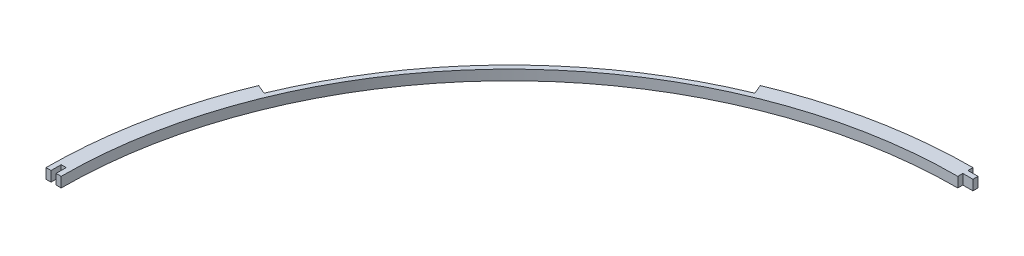
ISO-10303-21;
HEADER;
FILE_DESCRIPTION(('STEP AP214'),'2;1');
FILE_NAME('part.step','',(''),(''),'','','');
FILE_SCHEMA(('AUTOMOTIVE_DESIGN { 1 0 10303 214 1 1 1 1 }'));
ENDSEC;
DATA;
#1=APPLICATION_CONTEXT('core data for automotive mechanical design processes');
#2=APPLICATION_PROTOCOL_DEFINITION('international standard','automotive_design',2000,#1);
#3=PRODUCT_CONTEXT('',#1,'mechanical');
#4=PRODUCT('Part','Part','',(#3));
#5=PRODUCT_RELATED_PRODUCT_CATEGORY('part','',(#4));
#6=PRODUCT_DEFINITION_FORMATION('','',#4);
#7=PRODUCT_DEFINITION_CONTEXT('part definition',#1,'design');
#8=PRODUCT_DEFINITION('design','',#6,#7);
#9=PRODUCT_DEFINITION_SHAPE('','',#8);
#10=(LENGTH_UNIT() NAMED_UNIT(*) SI_UNIT(.MILLI.,.METRE.));
#11=(NAMED_UNIT(*) PLANE_ANGLE_UNIT() SI_UNIT($,.RADIAN.));
#12=(NAMED_UNIT(*) SI_UNIT($,.STERADIAN.) SOLID_ANGLE_UNIT());
#13=UNCERTAINTY_MEASURE_WITH_UNIT(LENGTH_MEASURE(1.E-05),#10,'distance_accuracy_value','');
#14=(GEOMETRIC_REPRESENTATION_CONTEXT(3) GLOBAL_UNCERTAINTY_ASSIGNED_CONTEXT((#13)) GLOBAL_UNIT_ASSIGNED_CONTEXT((#10,
#11,#12)) REPRESENTATION_CONTEXT('',''));
#15=CARTESIAN_POINT('',(0.,0.,0.));
#16=DIRECTION('',(0.,0.,1.));
#17=DIRECTION('',(1.,0.,0.));
#18=AXIS2_PLACEMENT_3D('',#15,#16,#17);
#19=CARTESIAN_POINT('',(-284.861,6.35,0.));
#20=DIRECTION('',(-1.,0.,0.));
#21=DIRECTION('',(0.,0.,1.));
#22=AXIS2_PLACEMENT_3D('',#19,#20,#21);
#23=PLANE('',#22);
#24=DIRECTION('',(0.,0.,-1.));
#25=VECTOR('',#24,1.);
#26=CARTESIAN_POINT('',(-284.861,0.,0.));
#27=LINE('',#26,#25);
#28=CARTESIAN_POINT('',(-284.861,0.,0.));
#29=VERTEX_POINT('',#28);
#30=CARTESIAN_POINT('',(-284.861,0.,-6.35));
#31=VERTEX_POINT('',#30);
#32=EDGE_CURVE('E175',#29,#31,#27,.T.);
#33=ORIENTED_EDGE('',*,*,#32,.F.);
#34=DIRECTION('',(0.,-1.,0.));
#35=VECTOR('',#34,1.);
#36=CARTESIAN_POINT('',(-284.861,6.35,0.));
#37=LINE('',#36,#35);
#38=CARTESIAN_POINT('',(-284.861,6.35,0.));
#39=VERTEX_POINT('',#38);
#40=EDGE_CURVE('E11',#39,#29,#37,.T.);
#41=ORIENTED_EDGE('',*,*,#40,.F.);
#42=DIRECTION('',(0.,0.,-1.));
#43=VECTOR('',#42,1.);
#44=CARTESIAN_POINT('',(-284.861,6.35,0.));
#45=LINE('',#44,#43);
#46=CARTESIAN_POINT('',(-284.861,6.35,-6.35));
#47=VERTEX_POINT('',#46);
#48=EDGE_CURVE('E217',#39,#47,#45,.T.);
#49=ORIENTED_EDGE('',*,*,#48,.T.);
#50=DIRECTION('',(0.,-1.,0.));
#51=VECTOR('',#50,1.);
#52=CARTESIAN_POINT('',(-284.861,6.35,-6.35));
#53=LINE('',#52,#51);
#54=EDGE_CURVE('E50',#47,#31,#53,.T.);
#55=ORIENTED_EDGE('',*,*,#54,.T.);
#56=EDGE_LOOP('',(#33,#41,#49,#55));
#57=FACE_BOUND('',#56,.T.);
#58=ADVANCED_FACE('F34',(#57),#23,.T.);
#59=CARTESIAN_POINT('',(0.,6.35,0.));
#60=DIRECTION('',(0.,0.,-1.));
#61=DIRECTION('',(-1.,0.,0.));
#62=AXIS2_PLACEMENT_3D('',#59,#60,#61);
#63=PLANE('',#62);
#64=DIRECTION('',(1.,0.,0.));
#65=VECTOR('',#64,1.);
#66=CARTESIAN_POINT('',(0.,0.,0.));
#67=LINE('',#66,#65);
#68=CARTESIAN_POINT('',(-281.686,0.,0.));
#69=VERTEX_POINT('',#68);
#70=EDGE_CURVE('E177',#29,#69,#67,.T.);
#71=ORIENTED_EDGE('',*,*,#70,.T.);
#72=DIRECTION('',(0.,-1.,0.));
#73=VECTOR('',#72,1.);
#74=CARTESIAN_POINT('',(-281.686,6.35,0.));
#75=LINE('',#74,#73);
#76=CARTESIAN_POINT('',(-281.686,6.35,0.));
#77=VERTEX_POINT('',#76);
#78=EDGE_CURVE('E42',#77,#69,#75,.T.);
#79=ORIENTED_EDGE('',*,*,#78,.F.);
#80=DIRECTION('',(1.,0.,0.));
#81=VECTOR('',#80,1.);
#82=CARTESIAN_POINT('',(0.,6.35,0.));
#83=LINE('',#82,#81);
#84=EDGE_CURVE('E264',#39,#77,#83,.T.);
#85=ORIENTED_EDGE('',*,*,#84,.F.);
#86=ORIENTED_EDGE('',*,*,#40,.T.);
#87=EDGE_LOOP('',(#71,#79,#85,#86));
#88=FACE_BOUND('',#87,.T.);
#89=ADVANCED_FACE('F251',(#88),#63,.F.);
#90=CARTESIAN_POINT('',(0.,6.35,0.));
#91=DIRECTION('',(0.,-1.,0.));
#92=DIRECTION('',(0.,0.,-1.));
#93=AXIS2_PLACEMENT_3D('',#90,#91,#92);
#94=CYLINDRICAL_SURFACE('',#93,281.686);
#95=CARTESIAN_POINT('',(0.,0.,0.));
#96=DIRECTION('',(0.,1.,0.));
#97=DIRECTION('',(0.,0.,1.));
#98=AXIS2_PLACEMENT_3D('',#95,#96,#97);
#99=CIRCLE('',#98,281.686);
#100=CARTESIAN_POINT('',(0.,0.,-281.686));
#101=VERTEX_POINT('',#100);
#102=EDGE_CURVE('E180',#101,#69,#99,.T.);
#103=ORIENTED_EDGE('',*,*,#102,.F.);
#104=DIRECTION('',(0.,-1.,0.));
#105=VECTOR('',#104,1.);
#106=CARTESIAN_POINT('',(0.,6.35,-281.686));
#107=LINE('',#106,#105);
#108=CARTESIAN_POINT('',(0.,6.35,-281.686));
#109=VERTEX_POINT('',#108);
#110=EDGE_CURVE('E241',#109,#101,#107,.T.);
#111=ORIENTED_EDGE('',*,*,#110,.F.);
#112=CARTESIAN_POINT('',(0.,6.35,0.));
#113=DIRECTION('',(0.,1.,0.));
#114=DIRECTION('',(0.,0.,1.));
#115=AXIS2_PLACEMENT_3D('',#112,#113,#114);
#116=CIRCLE('',#115,281.686);
#117=EDGE_CURVE('E248',#109,#77,#116,.T.);
#118=ORIENTED_EDGE('',*,*,#117,.T.);
#119=ORIENTED_EDGE('',*,*,#78,.T.);
#120=EDGE_LOOP('',(#103,#111,#118,#119));
#121=FACE_BOUND('',#120,.T.);
#122=ADVANCED_FACE('F246',(#121),#94,.F.);
#123=CARTESIAN_POINT('',(0.,6.35,0.));
#124=DIRECTION('',(1.,0.,0.));
#125=DIRECTION('',(0.,0.,-1.));
#126=AXIS2_PLACEMENT_3D('',#123,#124,#125);
#127=PLANE('',#126);
#128=DIRECTION('',(0.,0.,1.));
#129=VECTOR('',#128,1.);
#130=CARTESIAN_POINT('',(0.,0.,0.));
#131=LINE('',#130,#129);
#132=CARTESIAN_POINT('',(0.,0.,-284.861));
#133=VERTEX_POINT('',#132);
#134=EDGE_CURVE('E183',#133,#101,#131,.T.);
#135=ORIENTED_EDGE('',*,*,#134,.F.);
#136=DIRECTION('',(0.,-1.,0.));
#137=VECTOR('',#136,1.);
#138=CARTESIAN_POINT('',(0.,6.35,-284.861));
#139=LINE('',#138,#137);
#140=CARTESIAN_POINT('',(0.,6.35,-284.861));
#141=VERTEX_POINT('',#140);
#142=EDGE_CURVE('E239',#141,#133,#139,.T.);
#143=ORIENTED_EDGE('',*,*,#142,.F.);
#144=DIRECTION('',(0.,0.,1.));
#145=VECTOR('',#144,1.);
#146=CARTESIAN_POINT('',(0.,6.35,0.));
#147=LINE('',#146,#145);
#148=EDGE_CURVE('E261',#141,#109,#147,.T.);
#149=ORIENTED_EDGE('',*,*,#148,.T.);
#150=ORIENTED_EDGE('',*,*,#110,.T.);
#151=EDGE_LOOP('',(#135,#143,#149,#150));
#152=FACE_BOUND('',#151,.T.);
#153=ADVANCED_FACE('F258',(#152),#127,.T.);
#154=CARTESIAN_POINT('',(0.,6.35,-284.861));
#155=DIRECTION('',(0.,0.,1.));
#156=DIRECTION('',(1.,0.,0.));
#157=AXIS2_PLACEMENT_3D('',#154,#155,#156);
#158=PLANE('',#157);
#159=DIRECTION('',(-1.,0.,0.));
#160=VECTOR('',#159,1.);
#161=CARTESIAN_POINT('',(0.,0.,-284.861));
#162=LINE('',#161,#160);
#163=CARTESIAN_POINT('',(6.35,0.,-284.861));
#164=VERTEX_POINT('',#163);
#165=EDGE_CURVE('E186',#164,#133,#162,.T.);
#166=ORIENTED_EDGE('',*,*,#165,.F.);
#167=DIRECTION('',(0.,-1.,0.));
#168=VECTOR('',#167,1.);
#169=CARTESIAN_POINT('',(6.35,6.35,-284.861));
#170=LINE('',#169,#168);
#171=CARTESIAN_POINT('',(6.35,6.35,-284.861));
#172=VERTEX_POINT('',#171);
#173=EDGE_CURVE('E237',#172,#164,#170,.T.);
#174=ORIENTED_EDGE('',*,*,#173,.F.);
#175=DIRECTION('',(-1.,0.,0.));
#176=VECTOR('',#175,1.);
#177=CARTESIAN_POINT('',(0.,6.35,-284.861));
#178=LINE('',#177,#176);
#179=EDGE_CURVE('E266',#172,#141,#178,.T.);
#180=ORIENTED_EDGE('',*,*,#179,.T.);
#181=ORIENTED_EDGE('',*,*,#142,.T.);
#182=EDGE_LOOP('',(#166,#174,#180,#181));
#183=FACE_BOUND('',#182,.T.);
#184=ADVANCED_FACE('F320',(#183),#158,.T.);
#185=CARTESIAN_POINT('',(6.35,6.35,0.));
#186=DIRECTION('',(-1.,0.,0.));
#187=DIRECTION('',(0.,0.,1.));
#188=AXIS2_PLACEMENT_3D('',#185,#186,#187);
#189=PLANE('',#188);
#190=DIRECTION('',(0.,0.,-1.));
#191=VECTOR('',#190,1.);
#192=CARTESIAN_POINT('',(6.35,0.,0.));
#193=LINE('',#192,#191);
#194=CARTESIAN_POINT('',(6.35,0.,-288.036));
#195=VERTEX_POINT('',#194);
#196=EDGE_CURVE('E189',#164,#195,#193,.T.);
#197=ORIENTED_EDGE('',*,*,#196,.T.);
#198=DIRECTION('',(0.,-1.,0.));
#199=VECTOR('',#198,1.);
#200=CARTESIAN_POINT('',(6.35,6.35,-288.036));
#201=LINE('',#200,#199);
#202=CARTESIAN_POINT('',(6.35,6.35,-288.036));
#203=VERTEX_POINT('',#202);
#204=EDGE_CURVE('E235',#203,#195,#201,.T.);
#205=ORIENTED_EDGE('',*,*,#204,.F.);
#206=DIRECTION('',(0.,0.,-1.));
#207=VECTOR('',#206,1.);
#208=CARTESIAN_POINT('',(6.35,6.35,0.));
#209=LINE('',#208,#207);
#210=EDGE_CURVE('E272',#172,#203,#209,.T.);
#211=ORIENTED_EDGE('',*,*,#210,.F.);
#212=ORIENTED_EDGE('',*,*,#173,.T.);
#213=EDGE_LOOP('',(#197,#205,#211,#212));
#214=FACE_BOUND('',#213,.T.);
#215=ADVANCED_FACE('F323',(#214),#189,.F.);
#216=CARTESIAN_POINT('',(-2.51798581984985E-12,6.35,-288.036));
#217=DIRECTION('',(0.,0.,-1.));
#218=DIRECTION('',(-1.,0.,0.));
#219=AXIS2_PLACEMENT_3D('',#216,#217,#218);
#220=PLANE('',#219);
#221=DIRECTION('',(1.,0.,0.));
#222=VECTOR('',#221,1.);
#223=CARTESIAN_POINT('',(-2.51798581984985E-12,0.,-288.036));
#224=LINE('',#223,#222);
#225=CARTESIAN_POINT('',(0.,0.,-288.036));
#226=VERTEX_POINT('',#225);
#227=EDGE_CURVE('E192',#226,#195,#224,.T.);
#228=ORIENTED_EDGE('',*,*,#227,.F.);
#229=DIRECTION('',(0.,-1.,0.));
#230=VECTOR('',#229,1.);
#231=CARTESIAN_POINT('',(0.,6.35,-288.036));
#232=LINE('',#231,#230);
#233=CARTESIAN_POINT('',(0.,6.35,-288.036));
#234=VERTEX_POINT('',#233);
#235=EDGE_CURVE('E233',#234,#226,#232,.T.);
#236=ORIENTED_EDGE('',*,*,#235,.F.);
#237=DIRECTION('',(1.,0.,0.));
#238=VECTOR('',#237,1.);
#239=CARTESIAN_POINT('',(-2.51798581984985E-12,6.35,-288.036));
#240=LINE('',#239,#238);
#241=EDGE_CURVE('E274',#234,#203,#240,.T.);
#242=ORIENTED_EDGE('',*,*,#241,.T.);
#243=ORIENTED_EDGE('',*,*,#204,.T.);
#244=EDGE_LOOP('',(#228,#236,#242,#243));
#245=FACE_BOUND('',#244,.T.);
#246=ADVANCED_FACE('F327',(#245),#220,.T.);
#247=CARTESIAN_POINT('',(0.,6.35,0.));
#248=DIRECTION('',(1.,0.,0.));
#249=DIRECTION('',(0.,0.,-1.));
#250=AXIS2_PLACEMENT_3D('',#247,#248,#249);
#251=PLANE('',#250);
#252=DIRECTION('',(0.,0.,1.));
#253=VECTOR('',#252,1.);
#254=CARTESIAN_POINT('',(0.,0.,0.));
#255=LINE('',#254,#253);
#256=CARTESIAN_POINT('',(0.,0.,-291.211));
#257=VERTEX_POINT('',#256);
#258=EDGE_CURVE('E195',#257,#226,#255,.T.);
#259=ORIENTED_EDGE('',*,*,#258,.F.);
#260=DIRECTION('',(0.,-1.,0.));
#261=VECTOR('',#260,1.);
#262=CARTESIAN_POINT('',(0.,6.35,-291.211));
#263=LINE('',#262,#261);
#264=CARTESIAN_POINT('',(0.,6.35,-291.211));
#265=VERTEX_POINT('',#264);
#266=EDGE_CURVE('E231',#265,#257,#263,.T.);
#267=ORIENTED_EDGE('',*,*,#266,.F.);
#268=DIRECTION('',(0.,0.,1.));
#269=VECTOR('',#268,1.);
#270=CARTESIAN_POINT('',(0.,6.35,0.));
#271=LINE('',#270,#269);
#272=EDGE_CURVE('E277',#265,#234,#271,.T.);
#273=ORIENTED_EDGE('',*,*,#272,.T.);
#274=ORIENTED_EDGE('',*,*,#235,.T.);
#275=EDGE_LOOP('',(#259,#267,#273,#274));
#276=FACE_BOUND('',#275,.T.);
#277=ADVANCED_FACE('F331',(#276),#251,.T.);
#278=CARTESIAN_POINT('',(0.,6.35,0.));
#279=DIRECTION('',(0.,-1.,0.));
#280=DIRECTION('',(0.,0.,-1.));
#281=AXIS2_PLACEMENT_3D('',#278,#279,#280);
#282=CYLINDRICAL_SURFACE('',#281,291.211);
#283=CARTESIAN_POINT('',(0.,0.,0.));
#284=DIRECTION('',(0.,1.,0.));
#285=DIRECTION('',(0.,0.,1.));
#286=AXIS2_PLACEMENT_3D('',#283,#284,#285);
#287=CIRCLE('',#286,291.211);
#288=CARTESIAN_POINT('',(-111.441625022468,0.,-269.043882542145));
#289=VERTEX_POINT('',#288);
#290=EDGE_CURVE('E198',#257,#289,#287,.T.);
#291=ORIENTED_EDGE('',*,*,#290,.T.);
#292=DIRECTION('',(0.,-1.,0.));
#293=VECTOR('',#292,1.);
#294=CARTESIAN_POINT('',(-111.441625022468,6.35,-269.043882542145));
#295=LINE('',#294,#293);
#296=CARTESIAN_POINT('',(-111.441625022468,6.35,-269.043882542145));
#297=VERTEX_POINT('',#296);
#298=EDGE_CURVE('E229',#297,#289,#295,.T.);
#299=ORIENTED_EDGE('',*,*,#298,.F.);
#300=CARTESIAN_POINT('',(0.,6.35,0.));
#301=DIRECTION('',(0.,1.,0.));
#302=DIRECTION('',(0.,0.,1.));
#303=AXIS2_PLACEMENT_3D('',#300,#301,#302);
#304=CIRCLE('',#303,291.211);
#305=EDGE_CURVE('E280',#265,#297,#304,.T.);
#306=ORIENTED_EDGE('',*,*,#305,.F.);
#307=ORIENTED_EDGE('',*,*,#266,.T.);
#308=EDGE_LOOP('',(#291,#299,#306,#307));
#309=FACE_BOUND('',#308,.T.);
#310=ADVANCED_FACE('F335',(#309),#282,.T.);
#311=CARTESIAN_POINT('',(6.92355822057422E-13,6.35,-2.86783171484153E-13));
#312=DIRECTION('',(-0.923879532511289,0.,0.382683432365085));
#313=DIRECTION('',(0.382683432365085,0.,0.923879532511289));
#314=AXIS2_PLACEMENT_3D('',#311,#312,#313);
#315=PLANE('',#314);
#316=DIRECTION('',(-0.382683432365085,0.,-0.923879532511289));
#317=VECTOR('',#316,1.);
#318=CARTESIAN_POINT('',(6.92355822057422E-13,0.,-2.86783171484153E-13));
#319=LINE('',#318,#317);
#320=CARTESIAN_POINT('',(-109.01158522695,0.,-263.177247510699));
#321=VERTEX_POINT('',#320);
#322=EDGE_CURVE('E201',#321,#289,#319,.T.);
#323=ORIENTED_EDGE('',*,*,#322,.F.);
#324=DIRECTION('',(0.,-1.,0.));
#325=VECTOR('',#324,1.);
#326=CARTESIAN_POINT('',(-109.01158522695,6.35,-263.177247510699));
#327=LINE('',#326,#325);
#328=CARTESIAN_POINT('',(-109.01158522695,6.35,-263.177247510699));
#329=VERTEX_POINT('',#328);
#330=EDGE_CURVE('E227',#329,#321,#327,.T.);
#331=ORIENTED_EDGE('',*,*,#330,.F.);
#332=DIRECTION('',(-0.382683432365085,0.,-0.923879532511289));
#333=VECTOR('',#332,1.);
#334=CARTESIAN_POINT('',(6.92355822057422E-13,6.35,-2.86783171484153E-13));
#335=LINE('',#334,#333);
#336=EDGE_CURVE('E282',#329,#297,#335,.T.);
#337=ORIENTED_EDGE('',*,*,#336,.T.);
#338=ORIENTED_EDGE('',*,*,#298,.T.);
#339=EDGE_LOOP('',(#323,#331,#337,#338));
#340=FACE_BOUND('',#339,.T.);
#341=ADVANCED_FACE('F339',(#340),#315,.T.);
#342=CARTESIAN_POINT('',(0.,6.35,0.));
#343=DIRECTION('',(0.,-1.,0.));
#344=DIRECTION('',(0.,0.,-1.));
#345=AXIS2_PLACEMENT_3D('',#342,#343,#344);
#346=CYLINDRICAL_SURFACE('',#345,284.861);
#347=CARTESIAN_POINT('',(0.,0.,0.));
#348=DIRECTION('',(0.,1.,0.));
#349=DIRECTION('',(0.,0.,1.));
#350=AXIS2_PLACEMENT_3D('',#347,#348,#349);
#351=CIRCLE('',#350,284.861);
#352=CARTESIAN_POINT('',(-263.177247510697,0.,-109.011585226953));
#353=VERTEX_POINT('',#352);
#354=EDGE_CURVE('E204',#321,#353,#351,.T.);
#355=ORIENTED_EDGE('',*,*,#354,.T.);
#356=DIRECTION('',(0.,-1.,0.));
#357=VECTOR('',#356,1.);
#358=CARTESIAN_POINT('',(-263.177247510697,6.35,-109.011585226953));
#359=LINE('',#358,#357);
#360=CARTESIAN_POINT('',(-263.177247510697,6.35,-109.011585226953));
#361=VERTEX_POINT('',#360);
#362=EDGE_CURVE('E224',#361,#353,#359,.T.);
#363=ORIENTED_EDGE('',*,*,#362,.F.);
#364=CARTESIAN_POINT('',(0.,6.35,0.));
#365=DIRECTION('',(0.,1.,0.));
#366=DIRECTION('',(0.,0.,1.));
#367=AXIS2_PLACEMENT_3D('',#364,#365,#366);
#368=CIRCLE('',#367,284.861);
#369=EDGE_CURVE('E285',#329,#361,#368,.T.);
#370=ORIENTED_EDGE('',*,*,#369,.F.);
#371=ORIENTED_EDGE('',*,*,#330,.T.);
#372=EDGE_LOOP('',(#355,#363,#370,#371));
#373=FACE_BOUND('',#372,.T.);
#374=ADVANCED_FACE('F343',(#373),#346,.T.);
#375=CARTESIAN_POINT('',(1.24963111574452E-11,6.35,-3.01687638759479E-11));
#376=DIRECTION('',(-0.382683432364987,0.,0.923879532511329));
#377=DIRECTION('',(0.92387953251133,0.,0.382683432364987));
#378=AXIS2_PLACEMENT_3D('',#375,#376,#377);
#379=PLANE('',#378);
#380=DIRECTION('',(-0.92387953251133,0.,-0.382683432364987));
#381=VECTOR('',#380,1.);
#382=CARTESIAN_POINT('',(1.24963111574452E-11,0.,-3.01687638759479E-11));
#383=LINE('',#382,#381);
#384=CARTESIAN_POINT('',(-269.043882542144,0.,-111.44162502247));
#385=VERTEX_POINT('',#384);
#386=EDGE_CURVE('E206',#353,#385,#383,.T.);
#387=ORIENTED_EDGE('',*,*,#386,.T.);
#388=DIRECTION('',(0.,-1.,0.));
#389=VECTOR('',#388,1.);
#390=CARTESIAN_POINT('',(-269.043882542144,6.35,-111.44162502247));
#391=LINE('',#390,#389);
#392=CARTESIAN_POINT('',(-269.043882542144,6.35,-111.44162502247));
#393=VERTEX_POINT('',#392);
#394=EDGE_CURVE('E221',#393,#385,#391,.T.);
#395=ORIENTED_EDGE('',*,*,#394,.F.);
#396=DIRECTION('',(-0.92387953251133,0.,-0.382683432364987));
#397=VECTOR('',#396,1.);
#398=CARTESIAN_POINT('',(1.24963111574452E-11,6.35,-3.01687638759479E-11));
#399=LINE('',#398,#397);
#400=EDGE_CURVE('E287',#361,#393,#399,.T.);
#401=ORIENTED_EDGE('',*,*,#400,.F.);
#402=ORIENTED_EDGE('',*,*,#362,.T.);
#403=EDGE_LOOP('',(#387,#395,#401,#402));
#404=FACE_BOUND('',#403,.T.);
#405=ADVANCED_FACE('F294',(#404),#379,.F.);
#406=CARTESIAN_POINT('',(0.,6.35,0.));
#407=DIRECTION('',(0.,-1.,0.));
#408=DIRECTION('',(0.,0.,-1.));
#409=AXIS2_PLACEMENT_3D('',#406,#407,#408);
#410=CYLINDRICAL_SURFACE('',#409,291.211);
#411=CARTESIAN_POINT('',(0.,0.,0.));
#412=DIRECTION('',(0.,1.,0.));
#413=DIRECTION('',(0.,0.,1.));
#414=AXIS2_PLACEMENT_3D('',#411,#412,#413);
#415=CIRCLE('',#414,291.211);
#416=CARTESIAN_POINT('',(-291.211,0.,0.));
#417=VERTEX_POINT('',#416);
#418=EDGE_CURVE('E208',#385,#417,#415,.T.);
#419=ORIENTED_EDGE('',*,*,#418,.T.);
#420=DIRECTION('',(0.,-1.,0.));
#421=VECTOR('',#420,1.);
#422=CARTESIAN_POINT('',(-291.211,6.35,0.));
#423=LINE('',#422,#421);
#424=CARTESIAN_POINT('',(-291.211,6.35,0.));
#425=VERTEX_POINT('',#424);
#426=EDGE_CURVE('E157',#425,#417,#423,.T.);
#427=ORIENTED_EDGE('',*,*,#426,.F.);
#428=CARTESIAN_POINT('',(0.,6.35,0.));
#429=DIRECTION('',(0.,1.,0.));
#430=DIRECTION('',(0.,0.,1.));
#431=AXIS2_PLACEMENT_3D('',#428,#429,#430);
#432=CIRCLE('',#431,291.211);
#433=EDGE_CURVE('E166',#393,#425,#432,.T.);
#434=ORIENTED_EDGE('',*,*,#433,.F.);
#435=ORIENTED_EDGE('',*,*,#394,.T.);
#436=EDGE_LOOP('',(#419,#427,#434,#435));
#437=FACE_BOUND('',#436,.T.);
#438=ADVANCED_FACE('F298',(#437),#410,.T.);
#439=CARTESIAN_POINT('',(0.,6.35,0.));
#440=DIRECTION('',(0.,0.,1.));
#441=DIRECTION('',(1.,0.,0.));
#442=AXIS2_PLACEMENT_3D('',#439,#440,#441);
#443=PLANE('',#442);
#444=DIRECTION('',(-1.,0.,0.));
#445=VECTOR('',#444,1.);
#446=CARTESIAN_POINT('',(0.,0.,0.));
#447=LINE('',#446,#445);
#448=CARTESIAN_POINT('',(-288.036,0.,0.));
#449=VERTEX_POINT('',#448);
#450=EDGE_CURVE('E153',#449,#417,#447,.T.);
#451=ORIENTED_EDGE('',*,*,#450,.F.);
#452=DIRECTION('',(0.,-1.,0.));
#453=VECTOR('',#452,1.);
#454=CARTESIAN_POINT('',(-288.036,6.35,0.));
#455=LINE('',#454,#453);
#456=CARTESIAN_POINT('',(-288.036,6.35,0.));
#457=VERTEX_POINT('',#456);
#458=EDGE_CURVE('E148',#457,#449,#455,.T.);
#459=ORIENTED_EDGE('',*,*,#458,.F.);
#460=DIRECTION('',(-1.,0.,0.));
#461=VECTOR('',#460,1.);
#462=CARTESIAN_POINT('',(0.,6.35,0.));
#463=LINE('',#462,#461);
#464=EDGE_CURVE('E151',#457,#425,#463,.T.);
#465=ORIENTED_EDGE('',*,*,#464,.T.);
#466=ORIENTED_EDGE('',*,*,#426,.T.);
#467=EDGE_LOOP('',(#451,#459,#465,#466));
#468=FACE_BOUND('',#467,.T.);
#469=ADVANCED_FACE('F150',(#468),#443,.T.);
#470=CARTESIAN_POINT('',(-288.036,6.35,0.));
#471=DIRECTION('',(1.,0.,0.));
#472=DIRECTION('',(0.,0.,-1.));
#473=AXIS2_PLACEMENT_3D('',#470,#471,#472);
#474=PLANE('',#473);
#475=DIRECTION('',(0.,0.,1.));
#476=VECTOR('',#475,1.);
#477=CARTESIAN_POINT('',(-288.036,0.,0.));
#478=LINE('',#477,#476);
#479=CARTESIAN_POINT('',(-288.036,0.,-6.35));
#480=VERTEX_POINT('',#479);
#481=EDGE_CURVE('E212',#480,#449,#478,.T.);
#482=ORIENTED_EDGE('',*,*,#481,.F.);
#483=DIRECTION('',(0.,-1.,0.));
#484=VECTOR('',#483,1.);
#485=CARTESIAN_POINT('',(-288.036,6.35,-6.35));
#486=LINE('',#485,#484);
#487=CARTESIAN_POINT('',(-288.036,6.35,-6.35));
#488=VERTEX_POINT('',#487);
#489=EDGE_CURVE('E99',#488,#480,#486,.T.);
#490=ORIENTED_EDGE('',*,*,#489,.F.);
#491=DIRECTION('',(0.,0.,1.));
#492=VECTOR('',#491,1.);
#493=CARTESIAN_POINT('',(-288.036,6.35,0.));
#494=LINE('',#493,#492);
#495=EDGE_CURVE('E164',#488,#457,#494,.T.);
#496=ORIENTED_EDGE('',*,*,#495,.T.);
#497=ORIENTED_EDGE('',*,*,#458,.T.);
#498=EDGE_LOOP('',(#482,#490,#496,#497));
#499=FACE_BOUND('',#498,.T.);
#500=ADVANCED_FACE('F169',(#499),#474,.T.);
#501=CARTESIAN_POINT('',(0.,6.35,-6.35));
#502=DIRECTION('',(0.,0.,1.));
#503=DIRECTION('',(1.,0.,0.));
#504=AXIS2_PLACEMENT_3D('',#501,#502,#503);
#505=PLANE('',#504);
#506=DIRECTION('',(-1.,0.,0.));
#507=VECTOR('',#506,1.);
#508=CARTESIAN_POINT('',(0.,0.,-6.35));
#509=LINE('',#508,#507);
#510=EDGE_CURVE('E214',#31,#480,#509,.T.);
#511=ORIENTED_EDGE('',*,*,#510,.F.);
#512=ORIENTED_EDGE('',*,*,#54,.F.);
#513=DIRECTION('',(-1.,0.,0.));
#514=VECTOR('',#513,1.);
#515=CARTESIAN_POINT('',(0.,6.35,-6.35));
#516=LINE('',#515,#514);
#517=EDGE_CURVE('E170',#47,#488,#516,.T.);
#518=ORIENTED_EDGE('',*,*,#517,.T.);
#519=ORIENTED_EDGE('',*,*,#489,.T.);
#520=EDGE_LOOP('',(#511,#512,#518,#519));
#521=FACE_BOUND('',#520,.T.);
#522=ADVANCED_FACE('F299',(#521),#505,.T.);
#523=CARTESIAN_POINT('',(0.,6.35,0.));
#524=DIRECTION('',(0.,1.,0.));
#525=DIRECTION('',(0.,0.,1.));
#526=AXIS2_PLACEMENT_3D('',#523,#524,#525);
#527=PLANE('',#526);
#528=ORIENTED_EDGE('',*,*,#48,.F.);
#529=ORIENTED_EDGE('',*,*,#84,.T.);
#530=ORIENTED_EDGE('',*,*,#117,.F.);
#531=ORIENTED_EDGE('',*,*,#148,.F.);
#532=ORIENTED_EDGE('',*,*,#179,.F.);
#533=ORIENTED_EDGE('',*,*,#210,.T.);
#534=ORIENTED_EDGE('',*,*,#241,.F.);
#535=ORIENTED_EDGE('',*,*,#272,.F.);
#536=ORIENTED_EDGE('',*,*,#305,.T.);
#537=ORIENTED_EDGE('',*,*,#336,.F.);
#538=ORIENTED_EDGE('',*,*,#369,.T.);
#539=ORIENTED_EDGE('',*,*,#400,.T.);
#540=ORIENTED_EDGE('',*,*,#433,.T.);
#541=ORIENTED_EDGE('',*,*,#464,.F.);
#542=ORIENTED_EDGE('',*,*,#495,.F.);
#543=ORIENTED_EDGE('',*,*,#517,.F.);
#544=EDGE_LOOP('',(#528,#529,#530,#531,#532,#533,#534,#535,#536,#537,#538,#539,#540,#541,#542,#543));
#545=FACE_BOUND('',#544,.T.);
#546=ADVANCED_FACE('F162',(#545),#527,.T.);
#547=CARTESIAN_POINT('',(0.,0.,0.));
#548=DIRECTION('',(0.,1.,0.));
#549=DIRECTION('',(0.,0.,1.));
#550=AXIS2_PLACEMENT_3D('',#547,#548,#549);
#551=PLANE('',#550);
#552=ORIENTED_EDGE('',*,*,#32,.T.);
#553=ORIENTED_EDGE('',*,*,#510,.T.);
#554=ORIENTED_EDGE('',*,*,#481,.T.);
#555=ORIENTED_EDGE('',*,*,#450,.T.);
#556=ORIENTED_EDGE('',*,*,#418,.F.);
#557=ORIENTED_EDGE('',*,*,#386,.F.);
#558=ORIENTED_EDGE('',*,*,#354,.F.);
#559=ORIENTED_EDGE('',*,*,#322,.T.);
#560=ORIENTED_EDGE('',*,*,#290,.F.);
#561=ORIENTED_EDGE('',*,*,#258,.T.);
#562=ORIENTED_EDGE('',*,*,#227,.T.);
#563=ORIENTED_EDGE('',*,*,#196,.F.);
#564=ORIENTED_EDGE('',*,*,#165,.T.);
#565=ORIENTED_EDGE('',*,*,#134,.T.);
#566=ORIENTED_EDGE('',*,*,#102,.T.);
#567=ORIENTED_EDGE('',*,*,#70,.F.);
#568=EDGE_LOOP('',(#552,#553,#554,#555,#556,#557,#558,#559,#560,#561,#562,#563,#564,#565,#566,#567));
#569=FACE_BOUND('',#568,.T.);
#570=ADVANCED_FACE('F253',(#569),#551,.F.);
#571=CLOSED_SHELL('',(#58,#89,#122,#153,#184,#215,#246,#277,#310,#341,#374,#405,#438,#469,#500,
#522,#546,#570));
#572=MANIFOLD_SOLID_BREP('B2',#571);
#573=ADVANCED_BREP_SHAPE_REPRESENTATION('',(#18,#572),#14);
#574=SHAPE_DEFINITION_REPRESENTATION(#9,#573);
ENDSEC;
END-ISO-10303-21;
